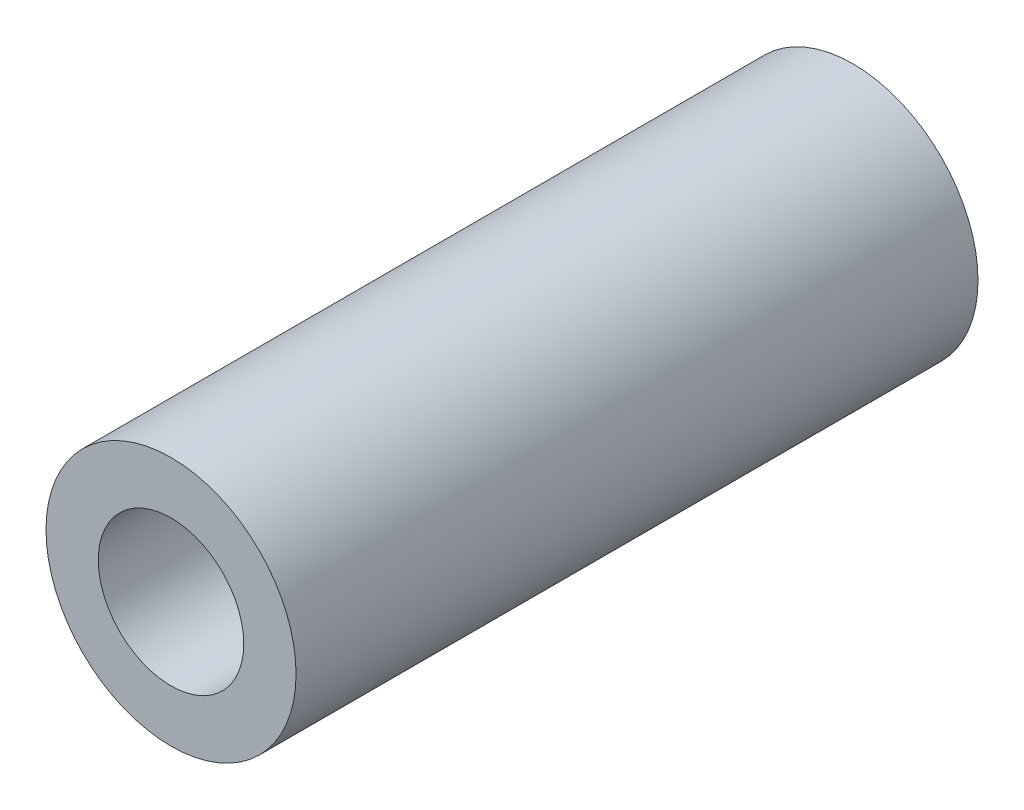
ISO-10303-21;
HEADER;
FILE_DESCRIPTION(('STEP AP214'),'2;1');
FILE_NAME('part.step','',(''),(''),'','','');
FILE_SCHEMA(('AUTOMOTIVE_DESIGN { 1 0 10303 214 1 1 1 1 }'));
ENDSEC;
DATA;
#1=APPLICATION_CONTEXT('core data for automotive mechanical design processes');
#2=APPLICATION_PROTOCOL_DEFINITION('international standard','automotive_design',2000,#1);
#3=PRODUCT_CONTEXT('',#1,'mechanical');
#4=PRODUCT('Part','Part','',(#3));
#5=PRODUCT_RELATED_PRODUCT_CATEGORY('part','',(#4));
#6=PRODUCT_DEFINITION_FORMATION('','',#4);
#7=PRODUCT_DEFINITION_CONTEXT('part definition',#1,'design');
#8=PRODUCT_DEFINITION('design','',#6,#7);
#9=PRODUCT_DEFINITION_SHAPE('','',#8);
#10=(LENGTH_UNIT() NAMED_UNIT(*) SI_UNIT(.MILLI.,.METRE.));
#11=(NAMED_UNIT(*) PLANE_ANGLE_UNIT() SI_UNIT($,.RADIAN.));
#12=(NAMED_UNIT(*) SI_UNIT($,.STERADIAN.) SOLID_ANGLE_UNIT());
#13=UNCERTAINTY_MEASURE_WITH_UNIT(LENGTH_MEASURE(1.E-05),#10,'distance_accuracy_value','');
#14=(GEOMETRIC_REPRESENTATION_CONTEXT(3) GLOBAL_UNCERTAINTY_ASSIGNED_CONTEXT((#13)) GLOBAL_UNIT_ASSIGNED_CONTEXT((#10,
#11,#12)) REPRESENTATION_CONTEXT('',''));
#15=CARTESIAN_POINT('',(0.,0.,0.));
#16=DIRECTION('',(0.,0.,1.));
#17=DIRECTION('',(1.,0.,0.));
#18=AXIS2_PLACEMENT_3D('',#15,#16,#17);
#19=CARTESIAN_POINT('',(0.,0.,15.));
#20=DIRECTION('',(0.,0.,1.));
#21=DIRECTION('',(1.,0.,0.));
#22=AXIS2_PLACEMENT_3D('',#19,#20,#21);
#23=PLANE('',#22);
#24=CARTESIAN_POINT('',(0.,0.,15.));
#25=DIRECTION('',(0.,0.,1.));
#26=DIRECTION('',(1.,0.,0.));
#27=AXIS2_PLACEMENT_3D('',#24,#25,#26);
#28=CIRCLE('',#27,2.75);
#29=CARTESIAN_POINT('',(2.75,0.,15.));
#30=VERTEX_POINT('',#29);
#31=EDGE_CURVE('E10',#30,#30,#28,.T.);
#32=ORIENTED_EDGE('',*,*,#31,.T.);
#33=EDGE_LOOP('',(#32));
#34=FACE_BOUND('',#33,.T.);
#35=CARTESIAN_POINT('',(0.,0.,15.));
#36=DIRECTION('',(0.,0.,1.));
#37=DIRECTION('',(1.,0.,0.));
#38=AXIS2_PLACEMENT_3D('',#35,#36,#37);
#39=CIRCLE('',#38,1.6);
#40=CARTESIAN_POINT('',(1.6,0.,15.));
#41=VERTEX_POINT('',#40);
#42=EDGE_CURVE('E46',#41,#41,#39,.T.);
#43=ORIENTED_EDGE('',*,*,#42,.F.);
#44=EDGE_LOOP('',(#43));
#45=FACE_BOUND('',#44,.T.);
#46=ADVANCED_FACE('F35',(#34,#45),#23,.T.);
#47=CARTESIAN_POINT('',(0.,0.,0.));
#48=DIRECTION('',(0.,0.,1.));
#49=DIRECTION('',(1.,0.,0.));
#50=AXIS2_PLACEMENT_3D('',#47,#48,#49);
#51=PLANE('',#50);
#52=CARTESIAN_POINT('',(0.,0.,0.));
#53=DIRECTION('',(0.,0.,1.));
#54=DIRECTION('',(1.,0.,0.));
#55=AXIS2_PLACEMENT_3D('',#52,#53,#54);
#56=CIRCLE('',#55,2.75);
#57=CARTESIAN_POINT('',(2.75,0.,0.));
#58=VERTEX_POINT('',#57);
#59=EDGE_CURVE('E39',#58,#58,#56,.T.);
#60=ORIENTED_EDGE('',*,*,#59,.F.);
#61=EDGE_LOOP('',(#60));
#62=FACE_BOUND('',#61,.T.);
#63=CARTESIAN_POINT('',(0.,0.,0.));
#64=DIRECTION('',(0.,0.,1.));
#65=DIRECTION('',(1.,0.,0.));
#66=AXIS2_PLACEMENT_3D('',#63,#64,#65);
#67=CIRCLE('',#66,1.6);
#68=CARTESIAN_POINT('',(1.6,0.,0.));
#69=VERTEX_POINT('',#68);
#70=EDGE_CURVE('E48',#69,#69,#67,.T.);
#71=ORIENTED_EDGE('',*,*,#70,.T.);
#72=EDGE_LOOP('',(#71));
#73=FACE_BOUND('',#72,.T.);
#74=ADVANCED_FACE('F58',(#62,#73),#51,.F.);
#75=CARTESIAN_POINT('',(0.,0.,15.));
#76=DIRECTION('',(0.,0.,-1.));
#77=DIRECTION('',(-1.,0.,0.));
#78=AXIS2_PLACEMENT_3D('',#75,#76,#77);
#79=CYLINDRICAL_SURFACE('',#78,2.75);
#80=ORIENTED_EDGE('',*,*,#31,.F.);
#81=EDGE_LOOP('',(#80));
#82=FACE_BOUND('',#81,.T.);
#83=ORIENTED_EDGE('',*,*,#59,.T.);
#84=EDGE_LOOP('',(#83));
#85=FACE_BOUND('',#84,.T.);
#86=ADVANCED_FACE('F37',(#82,#85),#79,.T.);
#87=CARTESIAN_POINT('',(0.,0.,15.));
#88=DIRECTION('',(0.,0.,-1.));
#89=DIRECTION('',(-1.,0.,0.));
#90=AXIS2_PLACEMENT_3D('',#87,#88,#89);
#91=CYLINDRICAL_SURFACE('',#90,1.6);
#92=ORIENTED_EDGE('',*,*,#42,.T.);
#93=EDGE_LOOP('',(#92));
#94=FACE_BOUND('',#93,.T.);
#95=ORIENTED_EDGE('',*,*,#70,.F.);
#96=EDGE_LOOP('',(#95));
#97=FACE_BOUND('',#96,.T.);
#98=ADVANCED_FACE('F54',(#94,#97),#91,.F.);
#99=CLOSED_SHELL('',(#46,#74,#86,#98));
#100=MANIFOLD_SOLID_BREP('B2',#99);
#101=ADVANCED_BREP_SHAPE_REPRESENTATION('',(#18,#100),#14);
#102=SHAPE_DEFINITION_REPRESENTATION(#9,#101);
ENDSEC;
END-ISO-10303-21;
